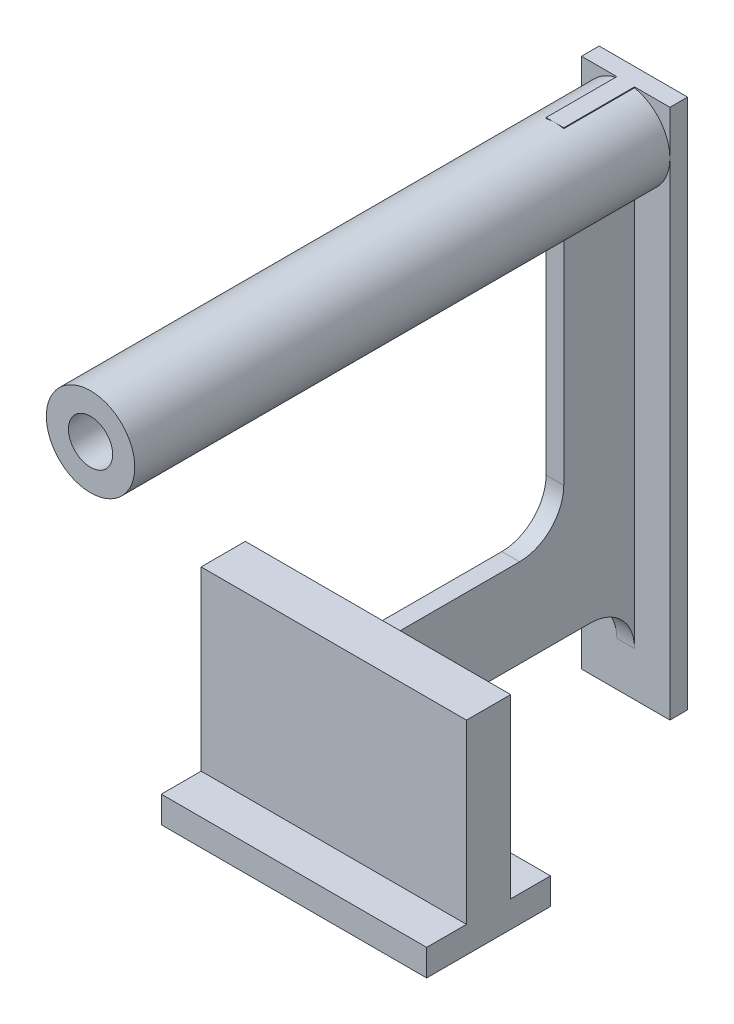
ISO-10303-21;
HEADER;
FILE_DESCRIPTION(('STEP AP214'),'2;1');
FILE_NAME('part.step','',(''),(''),'','','');
FILE_SCHEMA(('AUTOMOTIVE_DESIGN { 1 0 10303 214 1 1 1 1 }'));
ENDSEC;
DATA;
#1=APPLICATION_CONTEXT('core data for automotive mechanical design processes');
#2=APPLICATION_PROTOCOL_DEFINITION('international standard','automotive_design',2000,#1);
#3=PRODUCT_CONTEXT('',#1,'mechanical');
#4=PRODUCT('Part','Part','',(#3));
#5=PRODUCT_RELATED_PRODUCT_CATEGORY('part','',(#4));
#6=PRODUCT_DEFINITION_FORMATION('','',#4);
#7=PRODUCT_DEFINITION_CONTEXT('part definition',#1,'design');
#8=PRODUCT_DEFINITION('design','',#6,#7);
#9=PRODUCT_DEFINITION_SHAPE('','',#8);
#10=(LENGTH_UNIT() NAMED_UNIT(*) SI_UNIT(.MILLI.,.METRE.));
#11=(NAMED_UNIT(*) PLANE_ANGLE_UNIT() SI_UNIT($,.RADIAN.));
#12=(NAMED_UNIT(*) SI_UNIT($,.STERADIAN.) SOLID_ANGLE_UNIT());
#13=UNCERTAINTY_MEASURE_WITH_UNIT(LENGTH_MEASURE(1.E-05),#10,'distance_accuracy_value','');
#14=(GEOMETRIC_REPRESENTATION_CONTEXT(3) GLOBAL_UNCERTAINTY_ASSIGNED_CONTEXT((#13)) GLOBAL_UNIT_ASSIGNED_CONTEXT((#10,
#11,#12)) REPRESENTATION_CONTEXT('',''));
#15=CARTESIAN_POINT('',(0.,0.,0.));
#16=DIRECTION('',(0.,0.,1.));
#17=DIRECTION('',(1.,0.,0.));
#18=AXIS2_PLACEMENT_3D('',#15,#16,#17);
#19=CARTESIAN_POINT('',(14.,20.,0.));
#20=DIRECTION('',(1.,0.,0.));
#21=DIRECTION('',(0.,0.,-1.));
#22=AXIS2_PLACEMENT_3D('',#19,#20,#21);
#23=PLANE('',#22);
#24=DIRECTION('',(0.,-1.,0.));
#25=VECTOR('',#24,1.);
#26=CARTESIAN_POINT('',(14.,60.,-30.5));
#27=LINE('',#26,#25);
#28=CARTESIAN_POINT('',(14.,60.,-30.5));
#29=VERTEX_POINT('',#28);
#30=CARTESIAN_POINT('',(14.,59.8989794855664,-30.5));
#31=VERTEX_POINT('',#30);
#32=EDGE_CURVE('E334',#29,#31,#27,.T.);
#33=ORIENTED_EDGE('',*,*,#32,.T.);
#34=DIRECTION('',(0.,0.,1.));
#35=VECTOR('',#34,1.);
#36=CARTESIAN_POINT('',(14.,59.8989794855664,-46.6421356237309));
#37=LINE('',#36,#35);
#38=CARTESIAN_POINT('',(14.,59.8989794855664,-22.5));
#39=VERTEX_POINT('',#38);
#40=EDGE_CURVE('E282',#31,#39,#37,.T.);
#41=ORIENTED_EDGE('',*,*,#40,.T.);
#42=DIRECTION('',(0.,-1.,0.));
#43=VECTOR('',#42,1.);
#44=CARTESIAN_POINT('',(14.,60.,-22.5));
#45=LINE('',#44,#43);
#46=CARTESIAN_POINT('',(14.,60.,-22.5));
#47=VERTEX_POINT('',#46);
#48=EDGE_CURVE('E279',#47,#39,#45,.T.);
#49=ORIENTED_EDGE('',*,*,#48,.F.);
#50=DIRECTION('',(0.,0.,1.));
#51=VECTOR('',#50,1.);
#52=CARTESIAN_POINT('',(14.,60.,0.));
#53=LINE('',#52,#51);
#54=EDGE_CURVE('E290',#29,#47,#53,.T.);
#55=ORIENTED_EDGE('',*,*,#54,.F.);
#56=EDGE_LOOP('',(#33,#41,#49,#55));
#57=FACE_BOUND('',#56,.T.);
#58=ADVANCED_FACE('F41',(#57),#23,.F.);
#59=CARTESIAN_POINT('',(16.,20.,0.));
#60=DIRECTION('',(1.,0.,0.));
#61=DIRECTION('',(0.,0.,-1.));
#62=AXIS2_PLACEMENT_3D('',#59,#60,#61);
#63=PLANE('',#62);
#64=DIRECTION('',(0.,0.,1.));
#65=VECTOR('',#64,1.);
#66=CARTESIAN_POINT('',(16.,59.8989794855664,-46.6421356237309));
#67=LINE('',#66,#65);
#68=CARTESIAN_POINT('',(16.,59.8989794855664,-30.5));
#69=VERTEX_POINT('',#68);
#70=CARTESIAN_POINT('',(16.,59.8989794855664,-22.5));
#71=VERTEX_POINT('',#70);
#72=EDGE_CURVE('E263',#69,#71,#67,.T.);
#73=ORIENTED_EDGE('',*,*,#72,.F.);
#74=DIRECTION('',(0.,-1.,0.));
#75=VECTOR('',#74,1.);
#76=CARTESIAN_POINT('',(16.,60.,-30.5));
#77=LINE('',#76,#75);
#78=CARTESIAN_POINT('',(16.,60.,-30.5));
#79=VERTEX_POINT('',#78);
#80=EDGE_CURVE('E320',#79,#69,#77,.T.);
#81=ORIENTED_EDGE('',*,*,#80,.F.);
#82=DIRECTION('',(0.,0.,1.));
#83=VECTOR('',#82,1.);
#84=CARTESIAN_POINT('',(16.,60.,0.));
#85=LINE('',#84,#83);
#86=CARTESIAN_POINT('',(16.,60.,-22.5));
#87=VERTEX_POINT('',#86);
#88=EDGE_CURVE('E295',#79,#87,#85,.T.);
#89=ORIENTED_EDGE('',*,*,#88,.T.);
#90=DIRECTION('',(0.,-1.,0.));
#91=VECTOR('',#90,1.);
#92=CARTESIAN_POINT('',(16.,60.,-22.5));
#93=LINE('',#92,#91);
#94=EDGE_CURVE('E285',#87,#71,#93,.T.);
#95=ORIENTED_EDGE('',*,*,#94,.T.);
#96=EDGE_LOOP('',(#73,#81,#89,#95));
#97=FACE_BOUND('',#96,.T.);
#98=ADVANCED_FACE('F652',(#97),#63,.T.);
#99=CARTESIAN_POINT('',(0.,60.,-22.5));
#100=DIRECTION('',(0.,0.,-1.));
#101=DIRECTION('',(-1.,0.,0.));
#102=AXIS2_PLACEMENT_3D('',#99,#100,#101);
#103=PLANE('',#102);
#104=ORIENTED_EDGE('',*,*,#48,.T.);
#105=CARTESIAN_POINT('',(15.,55.,-22.5));
#106=DIRECTION('',(0.,0.,-1.));
#107=DIRECTION('',(-1.,0.,0.));
#108=AXIS2_PLACEMENT_3D('',#105,#106,#107);
#109=CIRCLE('',#108,5.);
#110=CARTESIAN_POINT('',(15.,60.,-22.5));
#111=VERTEX_POINT('',#110);
#112=EDGE_CURVE('E260',#39,#111,#109,.T.);
#113=ORIENTED_EDGE('',*,*,#112,.T.);
#114=DIRECTION('',(1.,0.,0.));
#115=VECTOR('',#114,1.);
#116=CARTESIAN_POINT('',(0.,60.,-22.5));
#117=LINE('',#116,#115);
#118=EDGE_CURVE('E277',#47,#111,#117,.T.);
#119=ORIENTED_EDGE('',*,*,#118,.F.);
#120=EDGE_LOOP('',(#104,#113,#119));
#121=FACE_BOUND('',#120,.T.);
#122=ADVANCED_FACE('F275',(#121),#103,.F.);
#123=EDGE_CURVE('E283',#111,#87,#117,.T.);
#124=ORIENTED_EDGE('',*,*,#123,.F.);
#125=EDGE_CURVE('E257',#111,#71,#109,.T.);
#126=ORIENTED_EDGE('',*,*,#125,.T.);
#127=ORIENTED_EDGE('',*,*,#94,.F.);
#128=EDGE_LOOP('',(#124,#126,#127));
#129=FACE_BOUND('',#128,.T.);
#130=ADVANCED_FACE('F284',(#129),#103,.F.);
#131=CARTESIAN_POINT('',(0.,60.,-30.5));
#132=DIRECTION('',(0.,0.,-1.));
#133=DIRECTION('',(-1.,0.,0.));
#134=AXIS2_PLACEMENT_3D('',#131,#132,#133);
#135=PLANE('',#134);
#136=ORIENTED_EDGE('',*,*,#80,.T.);
#137=CARTESIAN_POINT('',(15.,55.,-30.5));
#138=DIRECTION('',(0.,0.,-1.));
#139=DIRECTION('',(-1.,0.,0.));
#140=AXIS2_PLACEMENT_3D('',#137,#138,#139);
#141=CIRCLE('',#140,5.);
#142=CARTESIAN_POINT('',(20.,55.,-30.5));
#143=VERTEX_POINT('',#142);
#144=EDGE_CURVE('E601',#69,#143,#141,.T.);
#145=ORIENTED_EDGE('',*,*,#144,.T.);
#146=DIRECTION('',(0.,-1.,0.));
#147=VECTOR('',#146,1.);
#148=CARTESIAN_POINT('',(20.,60.,-30.5));
#149=LINE('',#148,#147);
#150=CARTESIAN_POINT('',(20.,60.,-30.5));
#151=VERTEX_POINT('',#150);
#152=EDGE_CURVE('E351',#151,#143,#149,.T.);
#153=ORIENTED_EDGE('',*,*,#152,.F.);
#154=DIRECTION('',(1.,0.,0.));
#155=VECTOR('',#154,1.);
#156=CARTESIAN_POINT('',(0.,60.,-30.5));
#157=LINE('',#156,#155);
#158=EDGE_CURVE('E319',#79,#151,#157,.T.);
#159=ORIENTED_EDGE('',*,*,#158,.F.);
#160=EDGE_LOOP('',(#136,#145,#153,#159));
#161=FACE_BOUND('',#160,.T.);
#162=ADVANCED_FACE('F660',(#161),#135,.F.);
#163=DIRECTION('',(0.,-1.,0.));
#164=VECTOR('',#163,1.);
#165=CARTESIAN_POINT('',(10.,60.,-30.5));
#166=LINE('',#165,#164);
#167=CARTESIAN_POINT('',(10.,60.,-30.5));
#168=VERTEX_POINT('',#167);
#169=CARTESIAN_POINT('',(10.,55.,-30.5));
#170=VERTEX_POINT('',#169);
#171=EDGE_CURVE('E340',#168,#170,#166,.T.);
#172=ORIENTED_EDGE('',*,*,#171,.T.);
#173=EDGE_CURVE('E595',#170,#31,#141,.T.);
#174=ORIENTED_EDGE('',*,*,#173,.T.);
#175=ORIENTED_EDGE('',*,*,#32,.F.);
#176=DIRECTION('',(1.,0.,0.));
#177=VECTOR('',#176,1.);
#178=CARTESIAN_POINT('',(0.,60.,-30.5));
#179=LINE('',#178,#177);
#180=EDGE_CURVE('E585',#168,#29,#179,.T.);
#181=ORIENTED_EDGE('',*,*,#180,.F.);
#182=EDGE_LOOP('',(#172,#174,#175,#181));
#183=FACE_BOUND('',#182,.T.);
#184=ADVANCED_FACE('F594',(#183),#135,.F.);
#185=CARTESIAN_POINT('',(30.,0.,-2.50000000000001));
#186=DIRECTION('',(0.,0.,-1.));
#187=DIRECTION('',(0.,1.,0.));
#188=AXIS2_PLACEMENT_3D('',#185,#186,#187);
#189=PLANE('',#188);
#190=DIRECTION('',(0.,-1.,0.));
#191=VECTOR('',#190,1.);
#192=CARTESIAN_POINT('',(14.,10.,-2.5));
#193=LINE('',#192,#191);
#194=CARTESIAN_POINT('',(14.,1.5,-2.5));
#195=VERTEX_POINT('',#194);
#196=CARTESIAN_POINT('',(14.,0.,-2.5));
#197=VERTEX_POINT('',#196);
#198=EDGE_CURVE('E307',#195,#197,#193,.T.);
#199=ORIENTED_EDGE('',*,*,#198,.F.);
#200=DIRECTION('',(-1.,0.,0.));
#201=VECTOR('',#200,1.);
#202=CARTESIAN_POINT('',(30.,1.5,-2.50000000000001));
#203=LINE('',#202,#201);
#204=CARTESIAN_POINT('',(0.,1.5,-2.50000000000001));
#205=VERTEX_POINT('',#204);
#206=EDGE_CURVE('E439',#195,#205,#203,.T.);
#207=ORIENTED_EDGE('',*,*,#206,.T.);
#208=DIRECTION('',(0.,-1.,0.));
#209=VECTOR('',#208,1.);
#210=CARTESIAN_POINT('',(0.,0.,-2.50000000000001));
#211=LINE('',#210,#209);
#212=CARTESIAN_POINT('',(0.,21.5,-2.5));
#213=VERTEX_POINT('',#212);
#214=EDGE_CURVE('E380',#213,#205,#211,.T.);
#215=ORIENTED_EDGE('',*,*,#214,.F.);
#216=DIRECTION('',(-1.,0.,0.));
#217=VECTOR('',#216,1.);
#218=CARTESIAN_POINT('',(30.,21.5,-2.5));
#219=LINE('',#218,#217);
#220=CARTESIAN_POINT('',(30.,21.5,-2.5));
#221=VERTEX_POINT('',#220);
#222=EDGE_CURVE('E460',#221,#213,#219,.T.);
#223=ORIENTED_EDGE('',*,*,#222,.F.);
#224=DIRECTION('',(0.,-1.,0.));
#225=VECTOR('',#224,1.);
#226=CARTESIAN_POINT('',(30.,0.,-2.50000000000001));
#227=LINE('',#226,#225);
#228=CARTESIAN_POINT('',(30.,1.5,-2.50000000000001));
#229=VERTEX_POINT('',#228);
#230=EDGE_CURVE('E381',#221,#229,#227,.T.);
#231=ORIENTED_EDGE('',*,*,#230,.T.);
#232=CARTESIAN_POINT('',(16.,1.5,-2.5));
#233=VERTEX_POINT('',#232);
#234=EDGE_CURVE('E434',#229,#233,#203,.T.);
#235=ORIENTED_EDGE('',*,*,#234,.T.);
#236=DIRECTION('',(0.,-1.,0.));
#237=VECTOR('',#236,1.);
#238=CARTESIAN_POINT('',(16.,10.,-2.5));
#239=LINE('',#238,#237);
#240=CARTESIAN_POINT('',(16.,0.,-2.5));
#241=VERTEX_POINT('',#240);
#242=EDGE_CURVE('E559',#233,#241,#239,.T.);
#243=ORIENTED_EDGE('',*,*,#242,.T.);
#244=DIRECTION('',(1.,0.,0.));
#245=VECTOR('',#244,1.);
#246=CARTESIAN_POINT('',(0.,0.,-2.50000000000001));
#247=LINE('',#246,#245);
#248=EDGE_CURVE('E551',#197,#241,#247,.T.);
#249=ORIENTED_EDGE('',*,*,#248,.F.);
#250=EDGE_LOOP('',(#199,#207,#215,#223,#231,#235,#243,#249));
#251=FACE_BOUND('',#250,.T.);
#252=DIRECTION('',(1.,0.,0.));
#253=VECTOR('',#252,1.);
#254=CARTESIAN_POINT('',(0.,20.,-2.50000000000001));
#255=LINE('',#254,#253);
#256=CARTESIAN_POINT('',(14.,20.,-2.5));
#257=VERTEX_POINT('',#256);
#258=CARTESIAN_POINT('',(16.,20.,-2.5));
#259=VERTEX_POINT('',#258);
#260=EDGE_CURVE('E358',#257,#259,#255,.T.);
#261=ORIENTED_EDGE('',*,*,#260,.F.);
#262=DIRECTION('',(0.,-1.,0.));
#263=VECTOR('',#262,1.);
#264=CARTESIAN_POINT('',(14.,20.,-2.5));
#265=LINE('',#264,#263);
#266=CARTESIAN_POINT('',(14.,10.,-2.5));
#267=VERTEX_POINT('',#266);
#268=EDGE_CURVE('E369',#257,#267,#265,.T.);
#269=ORIENTED_EDGE('',*,*,#268,.T.);
#270=DIRECTION('',(1.,0.,0.));
#271=VECTOR('',#270,1.);
#272=CARTESIAN_POINT('',(0.,10.,-2.50000000000001));
#273=LINE('',#272,#271);
#274=CARTESIAN_POINT('',(16.,10.,-2.5));
#275=VERTEX_POINT('',#274);
#276=EDGE_CURVE('E543',#267,#275,#273,.T.);
#277=ORIENTED_EDGE('',*,*,#276,.T.);
#278=DIRECTION('',(0.,-1.,0.));
#279=VECTOR('',#278,1.);
#280=CARTESIAN_POINT('',(16.,20.,-2.5));
#281=LINE('',#280,#279);
#282=EDGE_CURVE('E365',#259,#275,#281,.T.);
#283=ORIENTED_EDGE('',*,*,#282,.F.);
#284=EDGE_LOOP('',(#261,#269,#277,#283));
#285=FACE_BOUND('',#284,.T.);
#286=ADVANCED_FACE('F681',(#251,#285),#189,.T.);
#287=CARTESIAN_POINT('',(30.,0.,-7.));
#288=DIRECTION('',(0.,0.,-1.));
#289=DIRECTION('',(0.,1.,0.));
#290=AXIS2_PLACEMENT_3D('',#287,#288,#289);
#291=PLANE('',#290);
#292=DIRECTION('',(-1.,0.,0.));
#293=VECTOR('',#292,1.);
#294=CARTESIAN_POINT('',(30.,1.5,-7.));
#295=LINE('',#294,#293);
#296=CARTESIAN_POINT('',(14.,1.5,-7.));
#297=VERTEX_POINT('',#296);
#298=CARTESIAN_POINT('',(0.,1.5,-7.));
#299=VERTEX_POINT('',#298);
#300=EDGE_CURVE('E438',#297,#299,#295,.T.);
#301=ORIENTED_EDGE('',*,*,#300,.F.);
#302=DIRECTION('',(0.,-1.,0.));
#303=VECTOR('',#302,1.);
#304=CARTESIAN_POINT('',(14.,0.,-7.));
#305=LINE('',#304,#303);
#306=CARTESIAN_POINT('',(14.,0.,-7.));
#307=VERTEX_POINT('',#306);
#308=EDGE_CURVE('E376',#297,#307,#305,.T.);
#309=ORIENTED_EDGE('',*,*,#308,.T.);
#310=DIRECTION('',(1.,0.,0.));
#311=VECTOR('',#310,1.);
#312=CARTESIAN_POINT('',(30.,0.,-7.));
#313=LINE('',#312,#311);
#314=CARTESIAN_POINT('',(16.,0.,-7.));
#315=VERTEX_POINT('',#314);
#316=EDGE_CURVE('E470',#307,#315,#313,.T.);
#317=ORIENTED_EDGE('',*,*,#316,.T.);
#318=DIRECTION('',(0.,-1.,0.));
#319=VECTOR('',#318,1.);
#320=CARTESIAN_POINT('',(16.,0.,-7.));
#321=LINE('',#320,#319);
#322=CARTESIAN_POINT('',(16.,1.5,-7.));
#323=VERTEX_POINT('',#322);
#324=EDGE_CURVE('E373',#323,#315,#321,.T.);
#325=ORIENTED_EDGE('',*,*,#324,.F.);
#326=CARTESIAN_POINT('',(30.,1.5,-7.));
#327=VERTEX_POINT('',#326);
#328=EDGE_CURVE('E440',#327,#323,#295,.T.);
#329=ORIENTED_EDGE('',*,*,#328,.F.);
#330=DIRECTION('',(0.,-1.,0.));
#331=VECTOR('',#330,1.);
#332=CARTESIAN_POINT('',(30.,0.,-7.));
#333=LINE('',#332,#331);
#334=CARTESIAN_POINT('',(30.,-1.5,-7.));
#335=VERTEX_POINT('',#334);
#336=EDGE_CURVE('E404',#327,#335,#333,.T.);
#337=ORIENTED_EDGE('',*,*,#336,.T.);
#338=DIRECTION('',(-1.,0.,0.));
#339=VECTOR('',#338,1.);
#340=CARTESIAN_POINT('',(30.,-1.5,-7.));
#341=LINE('',#340,#339);
#342=CARTESIAN_POINT('',(0.,-1.5,-7.));
#343=VERTEX_POINT('',#342);
#344=EDGE_CURVE('E444',#335,#343,#341,.T.);
#345=ORIENTED_EDGE('',*,*,#344,.T.);
#346=DIRECTION('',(0.,-1.,0.));
#347=VECTOR('',#346,1.);
#348=CARTESIAN_POINT('',(0.,0.,-7.));
#349=LINE('',#348,#347);
#350=EDGE_CURVE('E430',#299,#343,#349,.T.);
#351=ORIENTED_EDGE('',*,*,#350,.F.);
#352=EDGE_LOOP('',(#301,#309,#317,#325,#329,#337,#345,#351));
#353=FACE_BOUND('',#352,.T.);
#354=ADVANCED_FACE('F684',(#353),#291,.T.);
#355=CARTESIAN_POINT('',(30.,1.5,0.));
#356=DIRECTION('',(0.,1.,0.));
#357=DIRECTION('',(0.,0.,1.));
#358=AXIS2_PLACEMENT_3D('',#355,#356,#357);
#359=PLANE('',#358);
#360=ORIENTED_EDGE('',*,*,#206,.F.);
#361=DIRECTION('',(0.,0.,-1.));
#362=VECTOR('',#361,1.);
#363=CARTESIAN_POINT('',(14.,1.5,0.));
#364=LINE('',#363,#362);
#365=EDGE_CURVE('E466',#195,#297,#364,.T.);
#366=ORIENTED_EDGE('',*,*,#365,.T.);
#367=ORIENTED_EDGE('',*,*,#300,.T.);
#368=DIRECTION('',(0.,0.,-1.));
#369=VECTOR('',#368,1.);
#370=CARTESIAN_POINT('',(0.,1.5,0.));
#371=LINE('',#370,#369);
#372=EDGE_CURVE('E386',#205,#299,#371,.T.);
#373=ORIENTED_EDGE('',*,*,#372,.F.);
#374=EDGE_LOOP('',(#360,#366,#367,#373));
#375=FACE_BOUND('',#374,.T.);
#376=ADVANCED_FACE('F690',(#375),#359,.T.);
#377=CARTESIAN_POINT('',(30.,21.5,0.));
#378=DIRECTION('',(0.,1.,0.));
#379=DIRECTION('',(0.,0.,1.));
#380=AXIS2_PLACEMENT_3D('',#377,#378,#379);
#381=PLANE('',#380);
#382=DIRECTION('',(0.,0.,-1.));
#383=VECTOR('',#382,1.);
#384=CARTESIAN_POINT('',(0.,21.5,0.));
#385=LINE('',#384,#383);
#386=CARTESIAN_POINT('',(0.,21.5,2.5));
#387=VERTEX_POINT('',#386);
#388=EDGE_CURVE('E411',#387,#213,#385,.T.);
#389=ORIENTED_EDGE('',*,*,#388,.F.);
#390=DIRECTION('',(-1.,0.,0.));
#391=VECTOR('',#390,1.);
#392=CARTESIAN_POINT('',(30.,21.5,2.5));
#393=LINE('',#392,#391);
#394=CARTESIAN_POINT('',(30.,21.5,2.5));
#395=VERTEX_POINT('',#394);
#396=EDGE_CURVE('E457',#395,#387,#393,.T.);
#397=ORIENTED_EDGE('',*,*,#396,.F.);
#398=DIRECTION('',(0.,0.,-1.));
#399=VECTOR('',#398,1.);
#400=CARTESIAN_POINT('',(30.,21.5,0.));
#401=LINE('',#400,#399);
#402=EDGE_CURVE('E385',#395,#221,#401,.T.);
#403=ORIENTED_EDGE('',*,*,#402,.T.);
#404=ORIENTED_EDGE('',*,*,#222,.T.);
#405=EDGE_LOOP('',(#389,#397,#403,#404));
#406=FACE_BOUND('',#405,.T.);
#407=ADVANCED_FACE('F686',(#406),#381,.T.);
#408=CARTESIAN_POINT('',(30.,0.,2.49999999999999));
#409=DIRECTION('',(0.,0.,-1.));
#410=DIRECTION('',(0.,1.,0.));
#411=AXIS2_PLACEMENT_3D('',#408,#409,#410);
#412=PLANE('',#411);
#413=DIRECTION('',(0.,-1.,0.));
#414=VECTOR('',#413,1.);
#415=CARTESIAN_POINT('',(0.,0.,2.49999999999999));
#416=LINE('',#415,#414);
#417=CARTESIAN_POINT('',(0.,1.5,2.5));
#418=VERTEX_POINT('',#417);
#419=EDGE_CURVE('E415',#387,#418,#416,.T.);
#420=ORIENTED_EDGE('',*,*,#419,.T.);
#421=DIRECTION('',(-1.,0.,0.));
#422=VECTOR('',#421,1.);
#423=CARTESIAN_POINT('',(30.,1.5,2.5));
#424=LINE('',#423,#422);
#425=CARTESIAN_POINT('',(30.,1.5,2.5));
#426=VERTEX_POINT('',#425);
#427=EDGE_CURVE('E454',#426,#418,#424,.T.);
#428=ORIENTED_EDGE('',*,*,#427,.F.);
#429=DIRECTION('',(0.,-1.,0.));
#430=VECTOR('',#429,1.);
#431=CARTESIAN_POINT('',(30.,0.,2.49999999999999));
#432=LINE('',#431,#430);
#433=EDGE_CURVE('E390',#395,#426,#432,.T.);
#434=ORIENTED_EDGE('',*,*,#433,.F.);
#435=ORIENTED_EDGE('',*,*,#396,.T.);
#436=EDGE_LOOP('',(#420,#428,#434,#435));
#437=FACE_BOUND('',#436,.T.);
#438=ADVANCED_FACE('F689',(#437),#412,.F.);
#439=CARTESIAN_POINT('',(0.,1.5,7.));
#440=VERTEX_POINT('',#439);
#441=EDGE_CURVE('E419',#440,#418,#371,.T.);
#442=ORIENTED_EDGE('',*,*,#441,.F.);
#443=DIRECTION('',(-1.,0.,0.));
#444=VECTOR('',#443,1.);
#445=CARTESIAN_POINT('',(30.,1.5,7.));
#446=LINE('',#445,#444);
#447=CARTESIAN_POINT('',(30.,1.5,7.));
#448=VERTEX_POINT('',#447);
#449=EDGE_CURVE('E451',#448,#440,#446,.T.);
#450=ORIENTED_EDGE('',*,*,#449,.F.);
#451=DIRECTION('',(0.,0.,-1.));
#452=VECTOR('',#451,1.);
#453=CARTESIAN_POINT('',(30.,1.5,0.));
#454=LINE('',#453,#452);
#455=EDGE_CURVE('E393',#448,#426,#454,.T.);
#456=ORIENTED_EDGE('',*,*,#455,.T.);
#457=ORIENTED_EDGE('',*,*,#427,.T.);
#458=EDGE_LOOP('',(#442,#450,#456,#457));
#459=FACE_BOUND('',#458,.T.);
#460=ADVANCED_FACE('F694',(#459),#359,.T.);
#461=CARTESIAN_POINT('',(30.,0.,7.));
#462=DIRECTION('',(0.,0.,-1.));
#463=DIRECTION('',(-1.,0.,0.));
#464=AXIS2_PLACEMENT_3D('',#461,#462,#463);
#465=PLANE('',#464);
#466=DIRECTION('',(0.,-1.,0.));
#467=VECTOR('',#466,1.);
#468=CARTESIAN_POINT('',(0.,0.,7.));
#469=LINE('',#468,#467);
#470=CARTESIAN_POINT('',(0.,-1.5,7.));
#471=VERTEX_POINT('',#470);
#472=EDGE_CURVE('E423',#440,#471,#469,.T.);
#473=ORIENTED_EDGE('',*,*,#472,.T.);
#474=DIRECTION('',(-1.,0.,0.));
#475=VECTOR('',#474,1.);
#476=CARTESIAN_POINT('',(30.,-1.5,7.));
#477=LINE('',#476,#475);
#478=CARTESIAN_POINT('',(30.,-1.5,7.));
#479=VERTEX_POINT('',#478);
#480=EDGE_CURVE('E447',#479,#471,#477,.T.);
#481=ORIENTED_EDGE('',*,*,#480,.F.);
#482=DIRECTION('',(0.,-1.,0.));
#483=VECTOR('',#482,1.);
#484=CARTESIAN_POINT('',(30.,0.,7.));
#485=LINE('',#484,#483);
#486=EDGE_CURVE('E397',#448,#479,#485,.T.);
#487=ORIENTED_EDGE('',*,*,#486,.F.);
#488=ORIENTED_EDGE('',*,*,#449,.T.);
#489=EDGE_LOOP('',(#473,#481,#487,#488));
#490=FACE_BOUND('',#489,.T.);
#491=ADVANCED_FACE('F696',(#490),#465,.F.);
#492=CARTESIAN_POINT('',(30.,-1.5,0.));
#493=DIRECTION('',(0.,1.,0.));
#494=DIRECTION('',(0.,0.,1.));
#495=AXIS2_PLACEMENT_3D('',#492,#493,#494);
#496=PLANE('',#495);
#497=DIRECTION('',(0.,0.,-1.));
#498=VECTOR('',#497,1.);
#499=CARTESIAN_POINT('',(0.,-1.5,0.));
#500=LINE('',#499,#498);
#501=EDGE_CURVE('E426',#471,#343,#500,.T.);
#502=ORIENTED_EDGE('',*,*,#501,.T.);
#503=ORIENTED_EDGE('',*,*,#344,.F.);
#504=DIRECTION('',(0.,0.,-1.));
#505=VECTOR('',#504,1.);
#506=CARTESIAN_POINT('',(30.,-1.5,0.));
#507=LINE('',#506,#505);
#508=EDGE_CURVE('E401',#479,#335,#507,.T.);
#509=ORIENTED_EDGE('',*,*,#508,.F.);
#510=ORIENTED_EDGE('',*,*,#480,.T.);
#511=EDGE_LOOP('',(#502,#503,#509,#510));
#512=FACE_BOUND('',#511,.T.);
#513=ADVANCED_FACE('F699',(#512),#496,.F.);
#514=DIRECTION('',(0.,0.,-1.));
#515=VECTOR('',#514,1.);
#516=CARTESIAN_POINT('',(16.,1.5,0.));
#517=LINE('',#516,#515);
#518=EDGE_CURVE('E463',#233,#323,#517,.T.);
#519=ORIENTED_EDGE('',*,*,#518,.F.);
#520=ORIENTED_EDGE('',*,*,#234,.F.);
#521=EDGE_CURVE('E398',#229,#327,#454,.T.);
#522=ORIENTED_EDGE('',*,*,#521,.T.);
#523=ORIENTED_EDGE('',*,*,#328,.T.);
#524=EDGE_LOOP('',(#519,#520,#522,#523));
#525=FACE_BOUND('',#524,.T.);
#526=ADVANCED_FACE('F703',(#525),#359,.T.);
#527=CARTESIAN_POINT('',(30.,0.,0.));
#528=DIRECTION('',(1.,0.,0.));
#529=DIRECTION('',(0.,0.,-1.));
#530=AXIS2_PLACEMENT_3D('',#527,#528,#529);
#531=PLANE('',#530);
#532=ORIENTED_EDGE('',*,*,#230,.F.);
#533=ORIENTED_EDGE('',*,*,#402,.F.);
#534=ORIENTED_EDGE('',*,*,#433,.T.);
#535=ORIENTED_EDGE('',*,*,#455,.F.);
#536=ORIENTED_EDGE('',*,*,#486,.T.);
#537=ORIENTED_EDGE('',*,*,#508,.T.);
#538=ORIENTED_EDGE('',*,*,#336,.F.);
#539=ORIENTED_EDGE('',*,*,#521,.F.);
#540=EDGE_LOOP('',(#532,#533,#534,#535,#536,#537,#538,#539));
#541=FACE_BOUND('',#540,.T.);
#542=ADVANCED_FACE('F710',(#541),#531,.T.);
#543=CARTESIAN_POINT('',(0.,0.,0.));
#544=DIRECTION('',(1.,0.,0.));
#545=DIRECTION('',(0.,0.,-1.));
#546=AXIS2_PLACEMENT_3D('',#543,#544,#545);
#547=PLANE('',#546);
#548=ORIENTED_EDGE('',*,*,#214,.T.);
#549=ORIENTED_EDGE('',*,*,#372,.T.);
#550=ORIENTED_EDGE('',*,*,#350,.T.);
#551=ORIENTED_EDGE('',*,*,#501,.F.);
#552=ORIENTED_EDGE('',*,*,#472,.F.);
#553=ORIENTED_EDGE('',*,*,#441,.T.);
#554=ORIENTED_EDGE('',*,*,#419,.F.);
#555=ORIENTED_EDGE('',*,*,#388,.T.);
#556=EDGE_LOOP('',(#548,#549,#550,#551,#552,#553,#554,#555));
#557=FACE_BOUND('',#556,.T.);
#558=ADVANCED_FACE('F671',(#557),#547,.F.);
#559=CARTESIAN_POINT('',(14.,50.1010205144336,-22.5));
#560=VERTEX_POINT('',#559);
#561=CARTESIAN_POINT('',(14.,25.,-22.5));
#562=VERTEX_POINT('',#561);
#563=EDGE_CURVE('E328',#560,#562,#45,.T.);
#564=ORIENTED_EDGE('',*,*,#563,.F.);
#565=DIRECTION('',(0.,0.,1.));
#566=VECTOR('',#565,1.);
#567=CARTESIAN_POINT('',(14.,50.1010205144336,-46.6421356237309));
#568=LINE('',#567,#566);
#569=CARTESIAN_POINT('',(14.,50.1010205144336,-30.5));
#570=VERTEX_POINT('',#569);
#571=EDGE_CURVE('E1067',#560,#570,#568,.F.);
#572=ORIENTED_EDGE('',*,*,#571,.T.);
#573=CARTESIAN_POINT('',(14.,5.00000000000001,-30.5));
#574=VERTEX_POINT('',#573);
#575=EDGE_CURVE('E332',#570,#574,#27,.T.);
#576=ORIENTED_EDGE('',*,*,#575,.T.);
#577=CARTESIAN_POINT('',(14.,5.,-25.5));
#578=DIRECTION('',(1.,0.,0.));
#579=DIRECTION('',(0.,0.,-1.));
#580=AXIS2_PLACEMENT_3D('',#577,#578,#579);
#581=CIRCLE('',#580,5.);
#582=CARTESIAN_POINT('',(14.,10.,-25.5));
#583=VERTEX_POINT('',#582);
#584=EDGE_CURVE('E492',#574,#583,#581,.T.);
#585=ORIENTED_EDGE('',*,*,#584,.T.);
#586=DIRECTION('',(0.,0.,1.));
#587=VECTOR('',#586,1.);
#588=CARTESIAN_POINT('',(14.,10.,0.));
#589=LINE('',#588,#587);
#590=EDGE_CURVE('E537',#583,#267,#589,.T.);
#591=ORIENTED_EDGE('',*,*,#590,.T.);
#592=ORIENTED_EDGE('',*,*,#268,.F.);
#593=DIRECTION('',(0.,0.,1.));
#594=VECTOR('',#593,1.);
#595=CARTESIAN_POINT('',(14.,20.,0.));
#596=LINE('',#595,#594);
#597=CARTESIAN_POINT('',(14.,20.,-17.5));
#598=VERTEX_POINT('',#597);
#599=EDGE_CURVE('E355',#598,#257,#596,.T.);
#600=ORIENTED_EDGE('',*,*,#599,.F.);
#601=CARTESIAN_POINT('',(14.,25.,-17.5));
#602=DIRECTION('',(1.,0.,0.));
#603=DIRECTION('',(0.,0.,-1.));
#604=AXIS2_PLACEMENT_3D('',#601,#602,#603);
#605=CIRCLE('',#604,5.);
#606=EDGE_CURVE('E11',#598,#562,#605,.T.);
#607=ORIENTED_EDGE('',*,*,#606,.T.);
#608=EDGE_LOOP('',(#564,#572,#576,#585,#591,#592,#600,#607));
#609=FACE_BOUND('',#608,.T.);
#610=ADVANCED_FACE('F535',(#609),#23,.F.);
#611=DIRECTION('',(0.,0.,1.));
#612=VECTOR('',#611,1.);
#613=CARTESIAN_POINT('',(16.,50.1010205144336,-46.6421356237309));
#614=LINE('',#613,#612);
#615=CARTESIAN_POINT('',(16.,50.1010205144336,-22.5));
#616=VERTEX_POINT('',#615);
#617=CARTESIAN_POINT('',(16.,50.1010205144336,-30.5));
#618=VERTEX_POINT('',#617);
#619=EDGE_CURVE('E604',#616,#618,#614,.F.);
#620=ORIENTED_EDGE('',*,*,#619,.F.);
#621=CARTESIAN_POINT('',(16.,25.,-22.5));
#622=VERTEX_POINT('',#621);
#623=EDGE_CURVE('E324',#616,#622,#93,.T.);
#624=ORIENTED_EDGE('',*,*,#623,.T.);
#625=CARTESIAN_POINT('',(16.,25.,-17.5));
#626=DIRECTION('',(1.,0.,0.));
#627=DIRECTION('',(0.,0.,-1.));
#628=AXIS2_PLACEMENT_3D('',#625,#626,#627);
#629=CIRCLE('',#628,5.);
#630=CARTESIAN_POINT('',(16.,20.,-17.5));
#631=VERTEX_POINT('',#630);
#632=EDGE_CURVE('E50',#622,#631,#629,.F.);
#633=ORIENTED_EDGE('',*,*,#632,.T.);
#634=DIRECTION('',(0.,0.,1.));
#635=VECTOR('',#634,1.);
#636=CARTESIAN_POINT('',(16.,20.,0.));
#637=LINE('',#636,#635);
#638=EDGE_CURVE('E362',#631,#259,#637,.T.);
#639=ORIENTED_EDGE('',*,*,#638,.T.);
#640=ORIENTED_EDGE('',*,*,#282,.T.);
#641=DIRECTION('',(0.,0.,1.));
#642=VECTOR('',#641,1.);
#643=CARTESIAN_POINT('',(16.,10.,0.));
#644=LINE('',#643,#642);
#645=CARTESIAN_POINT('',(16.,10.,-25.5));
#646=VERTEX_POINT('',#645);
#647=EDGE_CURVE('E528',#646,#275,#644,.T.);
#648=ORIENTED_EDGE('',*,*,#647,.F.);
#649=CARTESIAN_POINT('',(16.,5.,-25.5));
#650=DIRECTION('',(1.,0.,0.));
#651=DIRECTION('',(0.,0.,-1.));
#652=AXIS2_PLACEMENT_3D('',#649,#650,#651);
#653=CIRCLE('',#652,5.);
#654=CARTESIAN_POINT('',(16.,5.,-30.5));
#655=VERTEX_POINT('',#654);
#656=EDGE_CURVE('E488',#646,#655,#653,.F.);
#657=ORIENTED_EDGE('',*,*,#656,.T.);
#658=EDGE_CURVE('E297',#618,#655,#77,.T.);
#659=ORIENTED_EDGE('',*,*,#658,.F.);
#660=EDGE_LOOP('',(#620,#624,#633,#639,#640,#648,#657,#659));
#661=FACE_BOUND('',#660,.T.);
#662=ADVANCED_FACE('F527',(#661),#63,.T.);
#663=CARTESIAN_POINT('',(0.,20.,0.));
#664=DIRECTION('',(0.,1.,0.));
#665=DIRECTION('',(0.,0.,1.));
#666=AXIS2_PLACEMENT_3D('',#663,#664,#665);
#667=PLANE('',#666);
#668=ORIENTED_EDGE('',*,*,#638,.F.);
#669=DIRECTION('',(1.,0.,0.));
#670=VECTOR('',#669,1.);
#671=CARTESIAN_POINT('',(0.,20.,-17.5));
#672=LINE('',#671,#670);
#673=EDGE_CURVE('E63',#631,#598,#672,.F.);
#674=ORIENTED_EDGE('',*,*,#673,.T.);
#675=ORIENTED_EDGE('',*,*,#599,.T.);
#676=ORIENTED_EDGE('',*,*,#260,.T.);
#677=EDGE_LOOP('',(#668,#674,#675,#676));
#678=FACE_BOUND('',#677,.T.);
#679=ADVANCED_FACE('F789',(#678),#667,.T.);
#680=CARTESIAN_POINT('',(0.,0.,0.));
#681=DIRECTION('',(0.,1.,0.));
#682=DIRECTION('',(0.,0.,1.));
#683=AXIS2_PLACEMENT_3D('',#680,#681,#682);
#684=PLANE('',#683);
#685=DIRECTION('',(1.,0.,0.));
#686=VECTOR('',#685,1.);
#687=CARTESIAN_POINT('',(0.,0.,-30.5));
#688=LINE('',#687,#686);
#689=CARTESIAN_POINT('',(10.,0.,-30.5));
#690=VERTEX_POINT('',#689);
#691=CARTESIAN_POINT('',(20.,0.,-30.5));
#692=VERTEX_POINT('',#691);
#693=EDGE_CURVE('E302',#690,#692,#688,.T.);
#694=ORIENTED_EDGE('',*,*,#693,.F.);
#695=DIRECTION('',(0.,0.,-1.));
#696=VECTOR('',#695,1.);
#697=CARTESIAN_POINT('',(10.,0.,0.));
#698=LINE('',#697,#696);
#699=CARTESIAN_POINT('',(10.,0.,-32.5));
#700=VERTEX_POINT('',#699);
#701=EDGE_CURVE('E315',#690,#700,#698,.T.);
#702=ORIENTED_EDGE('',*,*,#701,.T.);
#703=DIRECTION('',(1.,0.,0.));
#704=VECTOR('',#703,1.);
#705=CARTESIAN_POINT('',(0.,0.,-32.5));
#706=LINE('',#705,#704);
#707=CARTESIAN_POINT('',(20.,0.,-32.5));
#708=VERTEX_POINT('',#707);
#709=EDGE_CURVE('E311',#700,#708,#706,.T.);
#710=ORIENTED_EDGE('',*,*,#709,.T.);
#711=DIRECTION('',(0.,0.,-1.));
#712=VECTOR('',#711,1.);
#713=CARTESIAN_POINT('',(20.,0.,0.));
#714=LINE('',#713,#712);
#715=EDGE_CURVE('E306',#692,#708,#714,.T.);
#716=ORIENTED_EDGE('',*,*,#715,.F.);
#717=EDGE_LOOP('',(#694,#702,#710,#716));
#718=FACE_BOUND('',#717,.T.);
#719=ADVANCED_FACE('F784',(#718),#684,.F.);
#720=ORIENTED_EDGE('',*,*,#563,.T.);
#721=DIRECTION('',(1.,0.,0.));
#722=VECTOR('',#721,1.);
#723=CARTESIAN_POINT('',(0.,25.,-22.5));
#724=LINE('',#723,#722);
#725=EDGE_CURVE('E482',#562,#622,#724,.T.);
#726=ORIENTED_EDGE('',*,*,#725,.T.);
#727=ORIENTED_EDGE('',*,*,#623,.F.);
#728=EDGE_CURVE('E271',#616,#560,#109,.T.);
#729=ORIENTED_EDGE('',*,*,#728,.T.);
#730=EDGE_LOOP('',(#720,#726,#727,#729));
#731=FACE_BOUND('',#730,.T.);
#732=ADVANCED_FACE('F655',(#731),#103,.F.);
#733=ORIENTED_EDGE('',*,*,#658,.T.);
#734=DIRECTION('',(1.,0.,0.));
#735=VECTOR('',#734,1.);
#736=CARTESIAN_POINT('',(14.,5.,-30.5));
#737=LINE('',#736,#735);
#738=EDGE_CURVE('E478',#655,#574,#737,.F.);
#739=ORIENTED_EDGE('',*,*,#738,.T.);
#740=ORIENTED_EDGE('',*,*,#575,.F.);
#741=EDGE_CURVE('E1069',#570,#170,#141,.T.);
#742=ORIENTED_EDGE('',*,*,#741,.T.);
#743=EDGE_CURVE('E338',#170,#690,#166,.T.);
#744=ORIENTED_EDGE('',*,*,#743,.T.);
#745=ORIENTED_EDGE('',*,*,#693,.T.);
#746=EDGE_CURVE('E350',#143,#692,#149,.T.);
#747=ORIENTED_EDGE('',*,*,#746,.F.);
#748=EDGE_CURVE('E524',#143,#618,#141,.T.);
#749=ORIENTED_EDGE('',*,*,#748,.T.);
#750=EDGE_LOOP('',(#733,#739,#740,#742,#744,#745,#747,#749));
#751=FACE_BOUND('',#750,.T.);
#752=ADVANCED_FACE('F519',(#751),#135,.F.);
#753=CARTESIAN_POINT('',(20.,60.,0.));
#754=DIRECTION('',(-1.,0.,0.));
#755=DIRECTION('',(0.,0.,1.));
#756=AXIS2_PLACEMENT_3D('',#753,#754,#755);
#757=PLANE('',#756);
#758=ORIENTED_EDGE('',*,*,#715,.T.);
#759=DIRECTION('',(0.,-1.,0.));
#760=VECTOR('',#759,1.);
#761=CARTESIAN_POINT('',(20.,60.,-32.5));
#762=LINE('',#761,#760);
#763=CARTESIAN_POINT('',(20.,60.,-32.5));
#764=VERTEX_POINT('',#763);
#765=EDGE_CURVE('E347',#764,#708,#762,.T.);
#766=ORIENTED_EDGE('',*,*,#765,.F.);
#767=DIRECTION('',(0.,0.,-1.));
#768=VECTOR('',#767,1.);
#769=CARTESIAN_POINT('',(20.,60.,0.));
#770=LINE('',#769,#768);
#771=EDGE_CURVE('E575',#151,#764,#770,.T.);
#772=ORIENTED_EDGE('',*,*,#771,.F.);
#773=ORIENTED_EDGE('',*,*,#152,.T.);
#774=ORIENTED_EDGE('',*,*,#746,.T.);
#775=EDGE_LOOP('',(#758,#766,#772,#773,#774));
#776=FACE_BOUND('',#775,.T.);
#777=ADVANCED_FACE('F662',(#776),#757,.F.);
#778=CARTESIAN_POINT('',(0.,60.,-32.5));
#779=DIRECTION('',(0.,0.,-1.));
#780=DIRECTION('',(-1.,0.,0.));
#781=AXIS2_PLACEMENT_3D('',#778,#779,#780);
#782=PLANE('',#781);
#783=ORIENTED_EDGE('',*,*,#709,.F.);
#784=DIRECTION('',(0.,-1.,0.));
#785=VECTOR('',#784,1.);
#786=CARTESIAN_POINT('',(10.,60.,-32.5));
#787=LINE('',#786,#785);
#788=CARTESIAN_POINT('',(10.,60.,-32.5));
#789=VERTEX_POINT('',#788);
#790=EDGE_CURVE('E344',#789,#700,#787,.T.);
#791=ORIENTED_EDGE('',*,*,#790,.F.);
#792=DIRECTION('',(1.,0.,0.));
#793=VECTOR('',#792,1.);
#794=CARTESIAN_POINT('',(0.,60.,-32.5));
#795=LINE('',#794,#793);
#796=EDGE_CURVE('E579',#789,#764,#795,.T.);
#797=ORIENTED_EDGE('',*,*,#796,.T.);
#798=ORIENTED_EDGE('',*,*,#765,.T.);
#799=EDGE_LOOP('',(#783,#791,#797,#798));
#800=FACE_BOUND('',#799,.T.);
#801=ADVANCED_FACE('F884',(#800),#782,.T.);
#802=CARTESIAN_POINT('',(10.,60.,0.));
#803=DIRECTION('',(-1.,0.,0.));
#804=DIRECTION('',(0.,0.,1.));
#805=AXIS2_PLACEMENT_3D('',#802,#803,#804);
#806=PLANE('',#805);
#807=ORIENTED_EDGE('',*,*,#743,.F.);
#808=ORIENTED_EDGE('',*,*,#171,.F.);
#809=DIRECTION('',(0.,0.,-1.));
#810=VECTOR('',#809,1.);
#811=CARTESIAN_POINT('',(10.,60.,0.));
#812=LINE('',#811,#810);
#813=EDGE_CURVE('E582',#168,#789,#812,.T.);
#814=ORIENTED_EDGE('',*,*,#813,.T.);
#815=ORIENTED_EDGE('',*,*,#790,.T.);
#816=ORIENTED_EDGE('',*,*,#701,.F.);
#817=EDGE_LOOP('',(#807,#808,#814,#815,#816));
#818=FACE_BOUND('',#817,.T.);
#819=ADVANCED_FACE('F894',(#818),#806,.T.);
#820=CARTESIAN_POINT('',(0.,60.,0.));
#821=DIRECTION('',(0.,1.,0.));
#822=DIRECTION('',(0.,0.,1.));
#823=AXIS2_PLACEMENT_3D('',#820,#821,#822);
#824=PLANE('',#823);
#825=ORIENTED_EDGE('',*,*,#118,.T.);
#826=ORIENTED_EDGE('',*,*,#123,.T.);
#827=ORIENTED_EDGE('',*,*,#88,.F.);
#828=ORIENTED_EDGE('',*,*,#158,.T.);
#829=ORIENTED_EDGE('',*,*,#771,.T.);
#830=ORIENTED_EDGE('',*,*,#796,.F.);
#831=ORIENTED_EDGE('',*,*,#813,.F.);
#832=ORIENTED_EDGE('',*,*,#180,.T.);
#833=ORIENTED_EDGE('',*,*,#54,.T.);
#834=EDGE_LOOP('',(#825,#826,#827,#828,#829,#830,#831,#832,#833));
#835=FACE_BOUND('',#834,.T.);
#836=ADVANCED_FACE('F292',(#835),#824,.T.);
#837=CARTESIAN_POINT('',(14.,10.,0.));
#838=DIRECTION('',(1.,0.,0.));
#839=DIRECTION('',(0.,0.,-1.));
#840=AXIS2_PLACEMENT_3D('',#837,#838,#839);
#841=PLANE('',#840);
#842=ORIENTED_EDGE('',*,*,#365,.F.);
#843=ORIENTED_EDGE('',*,*,#198,.T.);
#844=DIRECTION('',(0.,0.,1.));
#845=VECTOR('',#844,1.);
#846=CARTESIAN_POINT('',(14.,0.,0.));
#847=LINE('',#846,#845);
#848=EDGE_CURVE('E560',#307,#197,#847,.T.);
#849=ORIENTED_EDGE('',*,*,#848,.F.);
#850=ORIENTED_EDGE('',*,*,#308,.F.);
#851=EDGE_LOOP('',(#842,#843,#849,#850));
#852=FACE_BOUND('',#851,.T.);
#853=ADVANCED_FACE('F748',(#852),#841,.T.);
#854=CARTESIAN_POINT('',(16.,10.,0.));
#855=DIRECTION('',(1.,0.,0.));
#856=DIRECTION('',(0.,0.,-1.));
#857=AXIS2_PLACEMENT_3D('',#854,#855,#856);
#858=PLANE('',#857);
#859=ORIENTED_EDGE('',*,*,#324,.T.);
#860=DIRECTION('',(0.,0.,1.));
#861=VECTOR('',#860,1.);
#862=CARTESIAN_POINT('',(16.,0.,0.));
#863=LINE('',#862,#861);
#864=EDGE_CURVE('E545',#315,#241,#863,.T.);
#865=ORIENTED_EDGE('',*,*,#864,.T.);
#866=ORIENTED_EDGE('',*,*,#242,.F.);
#867=ORIENTED_EDGE('',*,*,#518,.T.);
#868=EDGE_LOOP('',(#859,#865,#866,#867));
#869=FACE_BOUND('',#868,.T.);
#870=ADVANCED_FACE('F743',(#869),#858,.F.);
#871=CARTESIAN_POINT('',(0.,10.,0.));
#872=DIRECTION('',(0.,1.,0.));
#873=DIRECTION('',(0.,0.,1.));
#874=AXIS2_PLACEMENT_3D('',#871,#872,#873);
#875=PLANE('',#874);
#876=ORIENTED_EDGE('',*,*,#590,.F.);
#877=DIRECTION('',(1.,0.,0.));
#878=VECTOR('',#877,1.);
#879=CARTESIAN_POINT('',(16.,10.,-25.5));
#880=LINE('',#879,#878);
#881=EDGE_CURVE('E474',#583,#646,#880,.T.);
#882=ORIENTED_EDGE('',*,*,#881,.T.);
#883=ORIENTED_EDGE('',*,*,#647,.T.);
#884=ORIENTED_EDGE('',*,*,#276,.F.);
#885=EDGE_LOOP('',(#876,#882,#883,#884));
#886=FACE_BOUND('',#885,.T.);
#887=ADVANCED_FACE('F541',(#886),#875,.F.);
#888=CARTESIAN_POINT('',(0.,0.,0.));
#889=DIRECTION('',(0.,1.,0.));
#890=DIRECTION('',(0.,0.,1.));
#891=AXIS2_PLACEMENT_3D('',#888,#889,#890);
#892=PLANE('',#891);
#893=ORIENTED_EDGE('',*,*,#848,.T.);
#894=ORIENTED_EDGE('',*,*,#248,.T.);
#895=ORIENTED_EDGE('',*,*,#864,.F.);
#896=ORIENTED_EDGE('',*,*,#316,.F.);
#897=EDGE_LOOP('',(#893,#894,#895,#896));
#898=FACE_BOUND('',#897,.T.);
#899=ADVANCED_FACE('F745',(#898),#892,.T.);
#900=CARTESIAN_POINT('',(15.,55.,-46.6421356237309));
#901=DIRECTION('',(0.,0.,1.));
#902=DIRECTION('',(1.,0.,0.));
#903=AXIS2_PLACEMENT_3D('',#900,#901,#902);
#904=CYLINDRICAL_SURFACE('',#903,2.5);
#905=CARTESIAN_POINT('',(15.,55.,30.));
#906=DIRECTION('',(0.,0.,1.));
#907=DIRECTION('',(1.,0.,0.));
#908=AXIS2_PLACEMENT_3D('',#905,#906,#907);
#909=CIRCLE('',#908,2.5);
#910=CARTESIAN_POINT('',(17.5,55.,30.));
#911=VERTEX_POINT('',#910);
#912=EDGE_CURVE('E1088',#911,#911,#909,.T.);
#913=ORIENTED_EDGE('',*,*,#912,.T.);
#914=EDGE_LOOP('',(#913));
#915=FACE_BOUND('',#914,.T.);
#916=DIRECTION('',(0.,0.,1.));
#917=VECTOR('',#916,1.);
#918=CARTESIAN_POINT('',(16.,57.2912878474779,-46.6421356237309));
#919=LINE('',#918,#917);
#920=CARTESIAN_POINT('',(16.,57.2912878474779,-30.5));
#921=VERTEX_POINT('',#920);
#922=CARTESIAN_POINT('',(16.,57.2912878474779,-22.5));
#923=VERTEX_POINT('',#922);
#924=EDGE_CURVE('E554',#921,#923,#919,.T.);
#925=ORIENTED_EDGE('',*,*,#924,.F.);
#926=CARTESIAN_POINT('',(15.,55.,-30.5));
#927=DIRECTION('',(0.,0.,-1.));
#928=DIRECTION('',(-1.,0.,0.));
#929=AXIS2_PLACEMENT_3D('',#926,#927,#928);
#930=CIRCLE('',#929,2.5);
#931=CARTESIAN_POINT('',(16.,52.7087121525221,-30.5));
#932=VERTEX_POINT('',#931);
#933=EDGE_CURVE('E564',#921,#932,#930,.T.);
#934=ORIENTED_EDGE('',*,*,#933,.T.);
#935=DIRECTION('',(0.,0.,1.));
#936=VECTOR('',#935,1.);
#937=CARTESIAN_POINT('',(16.,52.7087121525221,-46.6421356237309));
#938=LINE('',#937,#936);
#939=CARTESIAN_POINT('',(16.,52.7087121525221,-22.5));
#940=VERTEX_POINT('',#939);
#941=EDGE_CURVE('E621',#940,#932,#938,.F.);
#942=ORIENTED_EDGE('',*,*,#941,.F.);
#943=CARTESIAN_POINT('',(15.,55.,-22.5));
#944=DIRECTION('',(0.,0.,-1.));
#945=DIRECTION('',(-1.,0.,0.));
#946=AXIS2_PLACEMENT_3D('',#943,#944,#945);
#947=CIRCLE('',#946,2.5);
#948=CARTESIAN_POINT('',(14.,52.7087121525221,-22.5));
#949=VERTEX_POINT('',#948);
#950=EDGE_CURVE('E617',#940,#949,#947,.T.);
#951=ORIENTED_EDGE('',*,*,#950,.T.);
#952=DIRECTION('',(0.,0.,1.));
#953=VECTOR('',#952,1.);
#954=CARTESIAN_POINT('',(14.,52.7087121525221,-46.6421356237309));
#955=LINE('',#954,#953);
#956=CARTESIAN_POINT('',(14.,52.7087121525221,-30.5));
#957=VERTEX_POINT('',#956);
#958=EDGE_CURVE('E609',#949,#957,#955,.F.);
#959=ORIENTED_EDGE('',*,*,#958,.T.);
#960=CARTESIAN_POINT('',(14.,57.2912878474779,-30.5));
#961=VERTEX_POINT('',#960);
#962=EDGE_CURVE('E281',#957,#961,#930,.T.);
#963=ORIENTED_EDGE('',*,*,#962,.T.);
#964=DIRECTION('',(0.,0.,1.));
#965=VECTOR('',#964,1.);
#966=CARTESIAN_POINT('',(14.,57.2912878474779,-46.6421356237309));
#967=LINE('',#966,#965);
#968=CARTESIAN_POINT('',(14.,57.2912878474779,-22.5));
#969=VERTEX_POINT('',#968);
#970=EDGE_CURVE('E613',#961,#969,#967,.T.);
#971=ORIENTED_EDGE('',*,*,#970,.T.);
#972=EDGE_CURVE('E620',#969,#923,#947,.T.);
#973=ORIENTED_EDGE('',*,*,#972,.T.);
#974=EDGE_LOOP('',(#925,#934,#942,#951,#959,#963,#971,#973));
#975=FACE_BOUND('',#974,.T.);
#976=ADVANCED_FACE('F631',(#915,#975),#904,.F.);
#977=CARTESIAN_POINT('',(15.,55.,-46.6421356237309));
#978=DIRECTION('',(0.,0.,1.));
#979=DIRECTION('',(1.,0.,0.));
#980=AXIS2_PLACEMENT_3D('',#977,#978,#979);
#981=CYLINDRICAL_SURFACE('',#980,5.);
#982=CARTESIAN_POINT('',(15.,55.,30.));
#983=DIRECTION('',(0.,0.,1.));
#984=DIRECTION('',(1.,0.,0.));
#985=AXIS2_PLACEMENT_3D('',#982,#983,#984);
#986=CIRCLE('',#985,5.);
#987=CARTESIAN_POINT('',(20.,55.,30.));
#988=VERTEX_POINT('',#987);
#989=EDGE_CURVE('E269',#988,#988,#986,.T.);
#990=ORIENTED_EDGE('',*,*,#989,.F.);
#991=EDGE_LOOP('',(#990));
#992=FACE_BOUND('',#991,.T.);
#993=ORIENTED_EDGE('',*,*,#112,.F.);
#994=ORIENTED_EDGE('',*,*,#40,.F.);
#995=ORIENTED_EDGE('',*,*,#173,.F.);
#996=ORIENTED_EDGE('',*,*,#741,.F.);
#997=ORIENTED_EDGE('',*,*,#571,.F.);
#998=ORIENTED_EDGE('',*,*,#728,.F.);
#999=ORIENTED_EDGE('',*,*,#619,.T.);
#1000=ORIENTED_EDGE('',*,*,#748,.F.);
#1001=ORIENTED_EDGE('',*,*,#144,.F.);
#1002=ORIENTED_EDGE('',*,*,#72,.T.);
#1003=ORIENTED_EDGE('',*,*,#125,.F.);
#1004=EDGE_LOOP('',(#993,#994,#995,#996,#997,#998,#999,#1000,#1001,#1002,#1003));
#1005=FACE_BOUND('',#1004,.T.);
#1006=ADVANCED_FACE('F259',(#992,#1005),#981,.T.);
#1007=CARTESIAN_POINT('',(0.,0.,30.));
#1008=DIRECTION('',(0.,0.,1.));
#1009=DIRECTION('',(1.,0.,0.));
#1010=AXIS2_PLACEMENT_3D('',#1007,#1008,#1009);
#1011=PLANE('',#1010);
#1012=ORIENTED_EDGE('',*,*,#912,.F.);
#1013=EDGE_LOOP('',(#1012));
#1014=FACE_BOUND('',#1013,.T.);
#1015=ORIENTED_EDGE('',*,*,#989,.T.);
#1016=EDGE_LOOP('',(#1015));
#1017=FACE_BOUND('',#1016,.T.);
#1018=ADVANCED_FACE('F653',(#1014,#1017),#1011,.T.);
#1019=ORIENTED_EDGE('',*,*,#972,.F.);
#1020=EDGE_CURVE('E333',#969,#949,#45,.T.);
#1021=ORIENTED_EDGE('',*,*,#1020,.T.);
#1022=ORIENTED_EDGE('',*,*,#950,.F.);
#1023=EDGE_CURVE('E329',#923,#940,#93,.T.);
#1024=ORIENTED_EDGE('',*,*,#1023,.F.);
#1025=EDGE_LOOP('',(#1019,#1021,#1022,#1024));
#1026=FACE_BOUND('',#1025,.T.);
#1027=ADVANCED_FACE('F637',(#1026),#103,.F.);
#1028=ORIENTED_EDGE('',*,*,#933,.F.);
#1029=EDGE_CURVE('E325',#921,#932,#77,.T.);
#1030=ORIENTED_EDGE('',*,*,#1029,.T.);
#1031=EDGE_LOOP('',(#1028,#1030));
#1032=FACE_BOUND('',#1031,.T.);
#1033=ADVANCED_FACE('F642',(#1032),#135,.F.);
#1034=ORIENTED_EDGE('',*,*,#1029,.F.);
#1035=ORIENTED_EDGE('',*,*,#924,.T.);
#1036=ORIENTED_EDGE('',*,*,#1023,.T.);
#1037=ORIENTED_EDGE('',*,*,#941,.T.);
#1038=EDGE_LOOP('',(#1034,#1035,#1036,#1037));
#1039=FACE_BOUND('',#1038,.T.);
#1040=ADVANCED_FACE('F640',(#1039),#63,.T.);
#1041=ORIENTED_EDGE('',*,*,#962,.F.);
#1042=EDGE_CURVE('E339',#961,#957,#27,.T.);
#1043=ORIENTED_EDGE('',*,*,#1042,.F.);
#1044=EDGE_LOOP('',(#1041,#1043));
#1045=FACE_BOUND('',#1044,.T.);
#1046=ADVANCED_FACE('F646',(#1045),#135,.F.);
#1047=ORIENTED_EDGE('',*,*,#970,.F.);
#1048=ORIENTED_EDGE('',*,*,#1042,.T.);
#1049=ORIENTED_EDGE('',*,*,#958,.F.);
#1050=ORIENTED_EDGE('',*,*,#1020,.F.);
#1051=EDGE_LOOP('',(#1047,#1048,#1049,#1050));
#1052=FACE_BOUND('',#1051,.T.);
#1053=ADVANCED_FACE('F639',(#1052),#23,.F.);
#1054=CARTESIAN_POINT('',(0.,5.,-25.5));
#1055=DIRECTION('',(-1.,0.,0.));
#1056=DIRECTION('',(0.,0.,1.));
#1057=AXIS2_PLACEMENT_3D('',#1054,#1055,#1056);
#1058=CYLINDRICAL_SURFACE('',#1057,5.);
#1059=ORIENTED_EDGE('',*,*,#584,.F.);
#1060=ORIENTED_EDGE('',*,*,#738,.F.);
#1061=ORIENTED_EDGE('',*,*,#656,.F.);
#1062=ORIENTED_EDGE('',*,*,#881,.F.);
#1063=EDGE_LOOP('',(#1059,#1060,#1061,#1062));
#1064=FACE_BOUND('',#1063,.T.);
#1065=ADVANCED_FACE('F531',(#1064),#1058,.F.);
#1066=CARTESIAN_POINT('',(0.,25.,-17.5));
#1067=DIRECTION('',(1.,0.,0.));
#1068=DIRECTION('',(0.,0.,-1.));
#1069=AXIS2_PLACEMENT_3D('',#1066,#1067,#1068);
#1070=CYLINDRICAL_SURFACE('',#1069,5.);
#1071=ORIENTED_EDGE('',*,*,#606,.F.);
#1072=ORIENTED_EDGE('',*,*,#673,.F.);
#1073=ORIENTED_EDGE('',*,*,#632,.F.);
#1074=ORIENTED_EDGE('',*,*,#725,.F.);
#1075=EDGE_LOOP('',(#1071,#1072,#1073,#1074));
#1076=FACE_BOUND('',#1075,.T.);
#1077=ADVANCED_FACE('F43',(#1076),#1070,.F.);
#1078=CLOSED_SHELL('',(#58,#98,#122,#130,#162,#184,#286,#354,#376,#407,#438,#460,#491,#513,#526,
#542,#558,#610,#662,#679,#719,#732,#752,#777,#801,#819,#836,#853,#870,#887,#899,#976,#1006,
#1018,#1027,#1033,#1040,#1046,#1053,#1065,#1077));
#1079=MANIFOLD_SOLID_BREP('B2',#1078);
#1080=ADVANCED_BREP_SHAPE_REPRESENTATION('',(#18,#1079),#14);
#1081=SHAPE_DEFINITION_REPRESENTATION(#9,#1080);
ENDSEC;
END-ISO-10303-21;
